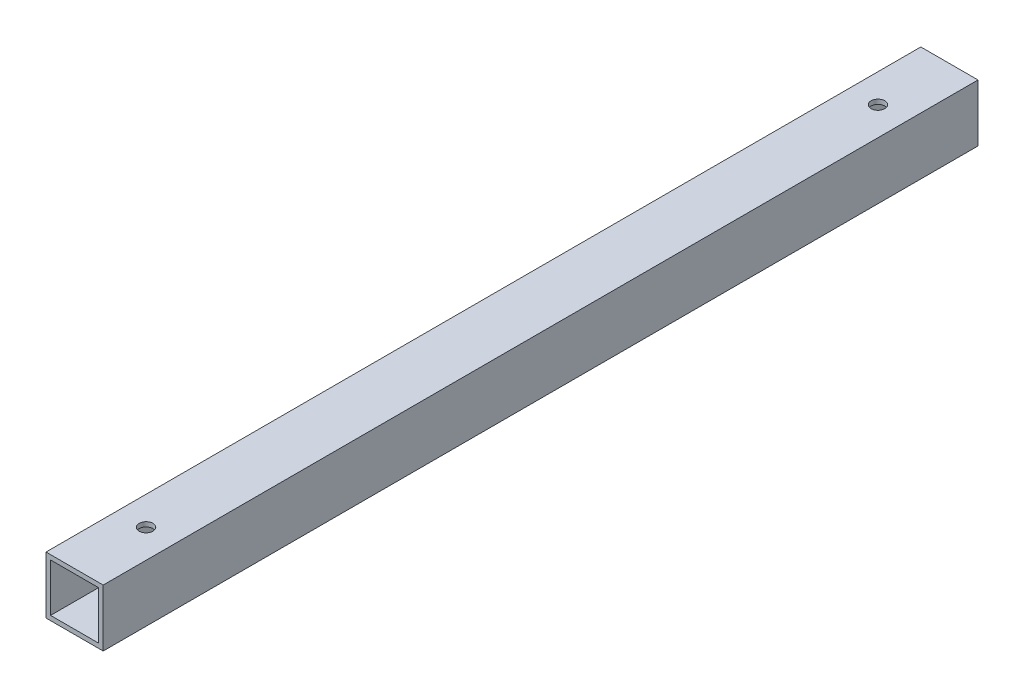
ISO-10303-21;
HEADER;
FILE_DESCRIPTION(('STEP AP214'),'2;1');
FILE_NAME('part.step','',(''),(''),'','','');
FILE_SCHEMA(('AUTOMOTIVE_DESIGN { 1 0 10303 214 1 1 1 1 }'));
ENDSEC;
DATA;
#1=APPLICATION_CONTEXT('core data for automotive mechanical design processes');
#2=APPLICATION_PROTOCOL_DEFINITION('international standard','automotive_design',2000,#1);
#3=PRODUCT_CONTEXT('',#1,'mechanical');
#4=PRODUCT('Part','Part','',(#3));
#5=PRODUCT_RELATED_PRODUCT_CATEGORY('part','',(#4));
#6=PRODUCT_DEFINITION_FORMATION('','',#4);
#7=PRODUCT_DEFINITION_CONTEXT('part definition',#1,'design');
#8=PRODUCT_DEFINITION('design','',#6,#7);
#9=PRODUCT_DEFINITION_SHAPE('','',#8);
#10=(LENGTH_UNIT() NAMED_UNIT(*) SI_UNIT(.MILLI.,.METRE.));
#11=(NAMED_UNIT(*) PLANE_ANGLE_UNIT() SI_UNIT($,.RADIAN.));
#12=(NAMED_UNIT(*) SI_UNIT($,.STERADIAN.) SOLID_ANGLE_UNIT());
#13=UNCERTAINTY_MEASURE_WITH_UNIT(LENGTH_MEASURE(1.E-05),#10,'distance_accuracy_value','');
#14=(GEOMETRIC_REPRESENTATION_CONTEXT(3) GLOBAL_UNCERTAINTY_ASSIGNED_CONTEXT((#13)) GLOBAL_UNIT_ASSIGNED_CONTEXT((#10,
#11,#12)) REPRESENTATION_CONTEXT('',''));
#15=CARTESIAN_POINT('',(0.,0.,0.));
#16=DIRECTION('',(0.,0.,1.));
#17=DIRECTION('',(1.,0.,0.));
#18=AXIS2_PLACEMENT_3D('',#15,#16,#17);
#19=CARTESIAN_POINT('',(0.,-25.,382.5));
#20=DIRECTION('',(0.,1.,0.));
#21=DIRECTION('',(0.,0.,1.));
#22=AXIS2_PLACEMENT_3D('',#19,#20,#21);
#23=PLANE('',#22);
#24=CARTESIAN_POINT('',(0.,-25.,320.));
#25=DIRECTION('',(0.,1.,0.));
#26=DIRECTION('',(0.,0.,1.));
#27=AXIS2_PLACEMENT_3D('',#24,#25,#26);
#28=CIRCLE('',#27,6.);
#29=CARTESIAN_POINT('',(0.,-25.,326.));
#30=VERTEX_POINT('',#29);
#31=EDGE_CURVE('E236',#30,#30,#28,.T.);
#32=ORIENTED_EDGE('',*,*,#31,.T.);
#33=EDGE_LOOP('',(#32));
#34=FACE_BOUND('',#33,.T.);
#35=CARTESIAN_POINT('',(-1.20015386316441E-13,-25.,-320.));
#36=DIRECTION('',(0.,1.,0.));
#37=DIRECTION('',(0.,0.,1.));
#38=AXIS2_PLACEMENT_3D('',#35,#36,#37);
#39=CIRCLE('',#38,6.);
#40=CARTESIAN_POINT('',(-1.20015386316441E-13,-25.,-314.));
#41=VERTEX_POINT('',#40);
#42=EDGE_CURVE('E163',#41,#41,#39,.T.);
#43=ORIENTED_EDGE('',*,*,#42,.T.);
#44=EDGE_LOOP('',(#43));
#45=FACE_BOUND('',#44,.T.);
#46=DIRECTION('',(1.,0.,0.));
#47=VECTOR('',#46,1.);
#48=CARTESIAN_POINT('',(0.,-25.,-382.5));
#49=LINE('',#48,#47);
#50=CARTESIAN_POINT('',(-25.,-25.,-382.5));
#51=VERTEX_POINT('',#50);
#52=CARTESIAN_POINT('',(25.,-25.,-382.5));
#53=VERTEX_POINT('',#52);
#54=EDGE_CURVE('E144',#51,#53,#49,.T.);
#55=ORIENTED_EDGE('',*,*,#54,.T.);
#56=DIRECTION('',(0.,0.,-1.));
#57=VECTOR('',#56,1.);
#58=CARTESIAN_POINT('',(25.,-25.,382.5));
#59=LINE('',#58,#57);
#60=CARTESIAN_POINT('',(25.,-25.,382.5));
#61=VERTEX_POINT('',#60);
#62=EDGE_CURVE('E11',#61,#53,#59,.T.);
#63=ORIENTED_EDGE('',*,*,#62,.F.);
#64=DIRECTION('',(1.,0.,0.));
#65=VECTOR('',#64,1.);
#66=CARTESIAN_POINT('',(0.,-25.,382.5));
#67=LINE('',#66,#65);
#68=CARTESIAN_POINT('',(-25.,-25.,382.5));
#69=VERTEX_POINT('',#68);
#70=EDGE_CURVE('E115',#69,#61,#67,.T.);
#71=ORIENTED_EDGE('',*,*,#70,.F.);
#72=DIRECTION('',(0.,0.,-1.));
#73=VECTOR('',#72,1.);
#74=CARTESIAN_POINT('',(-25.,-25.,382.5));
#75=LINE('',#74,#73);
#76=EDGE_CURVE('E54',#69,#51,#75,.T.);
#77=ORIENTED_EDGE('',*,*,#76,.T.);
#78=EDGE_LOOP('',(#55,#63,#71,#77));
#79=FACE_BOUND('',#78,.T.);
#80=ADVANCED_FACE('F35',(#34,#45,#79),#23,.F.);
#81=CARTESIAN_POINT('',(25.,0.,382.5));
#82=DIRECTION('',(-1.,0.,0.));
#83=DIRECTION('',(0.,0.,1.));
#84=AXIS2_PLACEMENT_3D('',#81,#82,#83);
#85=PLANE('',#84);
#86=DIRECTION('',(0.,1.,0.));
#87=VECTOR('',#86,1.);
#88=CARTESIAN_POINT('',(25.,0.,-382.5));
#89=LINE('',#88,#87);
#90=CARTESIAN_POINT('',(25.,25.,-382.5));
#91=VERTEX_POINT('',#90);
#92=EDGE_CURVE('E121',#53,#91,#89,.T.);
#93=ORIENTED_EDGE('',*,*,#92,.T.);
#94=DIRECTION('',(0.,0.,-1.));
#95=VECTOR('',#94,1.);
#96=CARTESIAN_POINT('',(25.,25.,382.5));
#97=LINE('',#96,#95);
#98=CARTESIAN_POINT('',(25.,25.,382.5));
#99=VERTEX_POINT('',#98);
#100=EDGE_CURVE('E45',#99,#91,#97,.T.);
#101=ORIENTED_EDGE('',*,*,#100,.F.);
#102=DIRECTION('',(0.,1.,0.));
#103=VECTOR('',#102,1.);
#104=CARTESIAN_POINT('',(25.,0.,382.5));
#105=LINE('',#104,#103);
#106=EDGE_CURVE('E109',#61,#99,#105,.T.);
#107=ORIENTED_EDGE('',*,*,#106,.F.);
#108=ORIENTED_EDGE('',*,*,#62,.T.);
#109=EDGE_LOOP('',(#93,#101,#107,#108));
#110=FACE_BOUND('',#109,.T.);
#111=ADVANCED_FACE('F120',(#110),#85,.F.);
#112=CARTESIAN_POINT('',(0.,25.,382.5));
#113=DIRECTION('',(0.,1.,0.));
#114=DIRECTION('',(0.,0.,1.));
#115=AXIS2_PLACEMENT_3D('',#112,#113,#114);
#116=PLANE('',#115);
#117=CARTESIAN_POINT('',(0.,25.,320.));
#118=DIRECTION('',(0.,1.,0.));
#119=DIRECTION('',(0.,0.,1.));
#120=AXIS2_PLACEMENT_3D('',#117,#118,#119);
#121=CIRCLE('',#120,6.);
#122=CARTESIAN_POINT('',(0.,25.,326.));
#123=VERTEX_POINT('',#122);
#124=EDGE_CURVE('E233',#123,#123,#121,.T.);
#125=ORIENTED_EDGE('',*,*,#124,.F.);
#126=EDGE_LOOP('',(#125));
#127=FACE_BOUND('',#126,.T.);
#128=CARTESIAN_POINT('',(-1.20015386316441E-13,25.,-320.));
#129=DIRECTION('',(0.,1.,0.));
#130=DIRECTION('',(0.,0.,1.));
#131=AXIS2_PLACEMENT_3D('',#128,#129,#130);
#132=CIRCLE('',#131,6.);
#133=CARTESIAN_POINT('',(-1.20015386316441E-13,25.,-314.));
#134=VERTEX_POINT('',#133);
#135=EDGE_CURVE('E169',#134,#134,#132,.T.);
#136=ORIENTED_EDGE('',*,*,#135,.F.);
#137=EDGE_LOOP('',(#136));
#138=FACE_BOUND('',#137,.T.);
#139=DIRECTION('',(1.,0.,0.));
#140=VECTOR('',#139,1.);
#141=CARTESIAN_POINT('',(0.,25.,-382.5));
#142=LINE('',#141,#140);
#143=CARTESIAN_POINT('',(-25.,25.,-382.5));
#144=VERTEX_POINT('',#143);
#145=EDGE_CURVE('E147',#144,#91,#142,.T.);
#146=ORIENTED_EDGE('',*,*,#145,.F.);
#147=DIRECTION('',(0.,0.,-1.));
#148=VECTOR('',#147,1.);
#149=CARTESIAN_POINT('',(-25.,25.,382.5));
#150=LINE('',#149,#148);
#151=CARTESIAN_POINT('',(-25.,25.,382.5));
#152=VERTEX_POINT('',#151);
#153=EDGE_CURVE('E80',#152,#144,#150,.T.);
#154=ORIENTED_EDGE('',*,*,#153,.F.);
#155=DIRECTION('',(1.,0.,0.));
#156=VECTOR('',#155,1.);
#157=CARTESIAN_POINT('',(0.,25.,382.5));
#158=LINE('',#157,#156);
#159=EDGE_CURVE('E114',#152,#99,#158,.T.);
#160=ORIENTED_EDGE('',*,*,#159,.T.);
#161=ORIENTED_EDGE('',*,*,#100,.T.);
#162=EDGE_LOOP('',(#146,#154,#160,#161));
#163=FACE_BOUND('',#162,.T.);
#164=ADVANCED_FACE('F125',(#127,#138,#163),#116,.T.);
#165=CARTESIAN_POINT('',(0.,-21.,382.5));
#166=DIRECTION('',(0.,1.,0.));
#167=DIRECTION('',(0.,0.,1.));
#168=AXIS2_PLACEMENT_3D('',#165,#166,#167);
#169=PLANE('',#168);
#170=CARTESIAN_POINT('',(0.,-21.,320.));
#171=DIRECTION('',(0.,1.,0.));
#172=DIRECTION('',(0.,0.,1.));
#173=AXIS2_PLACEMENT_3D('',#170,#171,#172);
#174=CIRCLE('',#173,6.);
#175=CARTESIAN_POINT('',(0.,-21.,326.));
#176=VERTEX_POINT('',#175);
#177=EDGE_CURVE('E174',#176,#176,#174,.T.);
#178=ORIENTED_EDGE('',*,*,#177,.F.);
#179=EDGE_LOOP('',(#178));
#180=FACE_BOUND('',#179,.T.);
#181=CARTESIAN_POINT('',(-1.20015386316441E-13,-21.,-320.));
#182=DIRECTION('',(0.,1.,0.));
#183=DIRECTION('',(0.,0.,1.));
#184=AXIS2_PLACEMENT_3D('',#181,#182,#183);
#185=CIRCLE('',#184,6.);
#186=CARTESIAN_POINT('',(-1.20015386316441E-13,-21.,-314.));
#187=VERTEX_POINT('',#186);
#188=EDGE_CURVE('E136',#187,#187,#185,.T.);
#189=ORIENTED_EDGE('',*,*,#188,.F.);
#190=EDGE_LOOP('',(#189));
#191=FACE_BOUND('',#190,.T.);
#192=DIRECTION('',(1.,0.,0.));
#193=VECTOR('',#192,1.);
#194=CARTESIAN_POINT('',(0.,-21.,-382.5));
#195=LINE('',#194,#193);
#196=CARTESIAN_POINT('',(-21.,-21.,-382.5));
#197=VERTEX_POINT('',#196);
#198=CARTESIAN_POINT('',(21.,-21.,-382.5));
#199=VERTEX_POINT('',#198);
#200=EDGE_CURVE('E132',#197,#199,#195,.T.);
#201=ORIENTED_EDGE('',*,*,#200,.F.);
#202=DIRECTION('',(0.,0.,-1.));
#203=VECTOR('',#202,1.);
#204=CARTESIAN_POINT('',(-21.,-21.,382.5));
#205=LINE('',#204,#203);
#206=CARTESIAN_POINT('',(-21.,-21.,382.5));
#207=VERTEX_POINT('',#206);
#208=EDGE_CURVE('E92',#207,#197,#205,.T.);
#209=ORIENTED_EDGE('',*,*,#208,.F.);
#210=DIRECTION('',(1.,0.,0.));
#211=VECTOR('',#210,1.);
#212=CARTESIAN_POINT('',(0.,-21.,382.5));
#213=LINE('',#212,#211);
#214=CARTESIAN_POINT('',(21.,-21.,382.5));
#215=VERTEX_POINT('',#214);
#216=EDGE_CURVE('E152',#207,#215,#213,.T.);
#217=ORIENTED_EDGE('',*,*,#216,.T.);
#218=DIRECTION('',(0.,0.,-1.));
#219=VECTOR('',#218,1.);
#220=CARTESIAN_POINT('',(21.,-21.,382.5));
#221=LINE('',#220,#219);
#222=EDGE_CURVE('E128',#215,#199,#221,.T.);
#223=ORIENTED_EDGE('',*,*,#222,.T.);
#224=EDGE_LOOP('',(#201,#209,#217,#223));
#225=FACE_BOUND('',#224,.T.);
#226=ADVANCED_FACE('F37',(#180,#191,#225),#169,.T.);
#227=CARTESIAN_POINT('',(-21.,0.,382.5));
#228=DIRECTION('',(-1.,0.,0.));
#229=DIRECTION('',(0.,0.,1.));
#230=AXIS2_PLACEMENT_3D('',#227,#228,#229);
#231=PLANE('',#230);
#232=DIRECTION('',(0.,1.,0.));
#233=VECTOR('',#232,1.);
#234=CARTESIAN_POINT('',(-21.,0.,-382.5));
#235=LINE('',#234,#233);
#236=CARTESIAN_POINT('',(-21.,21.,-382.5));
#237=VERTEX_POINT('',#236);
#238=EDGE_CURVE('E135',#197,#237,#235,.T.);
#239=ORIENTED_EDGE('',*,*,#238,.T.);
#240=DIRECTION('',(0.,0.,-1.));
#241=VECTOR('',#240,1.);
#242=CARTESIAN_POINT('',(-21.,21.,382.5));
#243=LINE('',#242,#241);
#244=CARTESIAN_POINT('',(-21.,21.,382.5));
#245=VERTEX_POINT('',#244);
#246=EDGE_CURVE('E158',#245,#237,#243,.T.);
#247=ORIENTED_EDGE('',*,*,#246,.F.);
#248=DIRECTION('',(0.,1.,0.));
#249=VECTOR('',#248,1.);
#250=CARTESIAN_POINT('',(-21.,0.,382.5));
#251=LINE('',#250,#249);
#252=EDGE_CURVE('E180',#207,#245,#251,.T.);
#253=ORIENTED_EDGE('',*,*,#252,.F.);
#254=ORIENTED_EDGE('',*,*,#208,.T.);
#255=EDGE_LOOP('',(#239,#247,#253,#254));
#256=FACE_BOUND('',#255,.T.);
#257=ADVANCED_FACE('F203',(#256),#231,.F.);
#258=CARTESIAN_POINT('',(0.,21.,382.5));
#259=DIRECTION('',(0.,1.,0.));
#260=DIRECTION('',(-1.,0.,0.));
#261=AXIS2_PLACEMENT_3D('',#258,#259,#260);
#262=PLANE('',#261);
#263=CARTESIAN_POINT('',(0.,21.,320.));
#264=DIRECTION('',(0.,1.,0.));
#265=DIRECTION('',(-1.,0.,0.));
#266=AXIS2_PLACEMENT_3D('',#263,#264,#265);
#267=CIRCLE('',#266,6.);
#268=CARTESIAN_POINT('',(-5.99999999999993,21.,320.));
#269=VERTEX_POINT('',#268);
#270=EDGE_CURVE('E39',#269,#269,#267,.T.);
#271=ORIENTED_EDGE('',*,*,#270,.T.);
#272=EDGE_LOOP('',(#271));
#273=FACE_BOUND('',#272,.T.);
#274=CARTESIAN_POINT('',(-1.20015386316441E-13,21.,-320.));
#275=DIRECTION('',(0.,1.,0.));
#276=DIRECTION('',(-1.,0.,0.));
#277=AXIS2_PLACEMENT_3D('',#274,#275,#276);
#278=CIRCLE('',#277,6.);
#279=CARTESIAN_POINT('',(-6.00000000000012,21.,-320.));
#280=VERTEX_POINT('',#279);
#281=EDGE_CURVE('E161',#280,#280,#278,.T.);
#282=ORIENTED_EDGE('',*,*,#281,.T.);
#283=EDGE_LOOP('',(#282));
#284=FACE_BOUND('',#283,.T.);
#285=DIRECTION('',(1.,0.,0.));
#286=VECTOR('',#285,1.);
#287=CARTESIAN_POINT('',(0.,21.,-382.5));
#288=LINE('',#287,#286);
#289=CARTESIAN_POINT('',(21.,21.,-382.5));
#290=VERTEX_POINT('',#289);
#291=EDGE_CURVE('E138',#237,#290,#288,.T.);
#292=ORIENTED_EDGE('',*,*,#291,.T.);
#293=DIRECTION('',(0.,0.,-1.));
#294=VECTOR('',#293,1.);
#295=CARTESIAN_POINT('',(21.,21.,382.5));
#296=LINE('',#295,#294);
#297=CARTESIAN_POINT('',(21.,21.,382.5));
#298=VERTEX_POINT('',#297);
#299=EDGE_CURVE('E156',#298,#290,#296,.T.);
#300=ORIENTED_EDGE('',*,*,#299,.F.);
#301=DIRECTION('',(1.,0.,0.));
#302=VECTOR('',#301,1.);
#303=CARTESIAN_POINT('',(0.,21.,382.5));
#304=LINE('',#303,#302);
#305=EDGE_CURVE('E182',#245,#298,#304,.T.);
#306=ORIENTED_EDGE('',*,*,#305,.F.);
#307=ORIENTED_EDGE('',*,*,#246,.T.);
#308=EDGE_LOOP('',(#292,#300,#306,#307));
#309=FACE_BOUND('',#308,.T.);
#310=ADVANCED_FACE('F196',(#273,#284,#309),#262,.F.);
#311=CARTESIAN_POINT('',(21.,0.,382.5));
#312=DIRECTION('',(-1.,0.,0.));
#313=DIRECTION('',(0.,-1.,0.));
#314=AXIS2_PLACEMENT_3D('',#311,#312,#313);
#315=PLANE('',#314);
#316=DIRECTION('',(0.,1.,0.));
#317=VECTOR('',#316,1.);
#318=CARTESIAN_POINT('',(21.,0.,-382.5));
#319=LINE('',#318,#317);
#320=EDGE_CURVE('E141',#199,#290,#319,.T.);
#321=ORIENTED_EDGE('',*,*,#320,.F.);
#322=ORIENTED_EDGE('',*,*,#222,.F.);
#323=DIRECTION('',(0.,1.,0.));
#324=VECTOR('',#323,1.);
#325=CARTESIAN_POINT('',(21.,0.,382.5));
#326=LINE('',#325,#324);
#327=EDGE_CURVE('E184',#215,#298,#326,.T.);
#328=ORIENTED_EDGE('',*,*,#327,.T.);
#329=ORIENTED_EDGE('',*,*,#299,.T.);
#330=EDGE_LOOP('',(#321,#322,#328,#329));
#331=FACE_BOUND('',#330,.T.);
#332=ADVANCED_FACE('F189',(#331),#315,.T.);
#333=CARTESIAN_POINT('',(-25.,0.,382.5));
#334=DIRECTION('',(-1.,0.,0.));
#335=DIRECTION('',(0.,0.,1.));
#336=AXIS2_PLACEMENT_3D('',#333,#334,#335);
#337=PLANE('',#336);
#338=DIRECTION('',(0.,1.,0.));
#339=VECTOR('',#338,1.);
#340=CARTESIAN_POINT('',(-25.,0.,-382.5));
#341=LINE('',#340,#339);
#342=EDGE_CURVE('E149',#51,#144,#341,.T.);
#343=ORIENTED_EDGE('',*,*,#342,.F.);
#344=ORIENTED_EDGE('',*,*,#76,.F.);
#345=DIRECTION('',(0.,1.,0.));
#346=VECTOR('',#345,1.);
#347=CARTESIAN_POINT('',(-25.,0.,382.5));
#348=LINE('',#347,#346);
#349=EDGE_CURVE('E126',#69,#152,#348,.T.);
#350=ORIENTED_EDGE('',*,*,#349,.T.);
#351=ORIENTED_EDGE('',*,*,#153,.T.);
#352=EDGE_LOOP('',(#343,#344,#350,#351));
#353=FACE_BOUND('',#352,.T.);
#354=ADVANCED_FACE('F225',(#353),#337,.T.);
#355=CARTESIAN_POINT('',(0.,0.,382.5));
#356=DIRECTION('',(0.,0.,1.));
#357=DIRECTION('',(1.,0.,0.));
#358=AXIS2_PLACEMENT_3D('',#355,#356,#357);
#359=PLANE('',#358);
#360=ORIENTED_EDGE('',*,*,#216,.F.);
#361=ORIENTED_EDGE('',*,*,#252,.T.);
#362=ORIENTED_EDGE('',*,*,#305,.T.);
#363=ORIENTED_EDGE('',*,*,#327,.F.);
#364=EDGE_LOOP('',(#360,#361,#362,#363));
#365=FACE_BOUND('',#364,.T.);
#366=ORIENTED_EDGE('',*,*,#70,.T.);
#367=ORIENTED_EDGE('',*,*,#106,.T.);
#368=ORIENTED_EDGE('',*,*,#159,.F.);
#369=ORIENTED_EDGE('',*,*,#349,.F.);
#370=EDGE_LOOP('',(#366,#367,#368,#369));
#371=FACE_BOUND('',#370,.T.);
#372=ADVANCED_FACE('F111',(#365,#371),#359,.T.);
#373=CARTESIAN_POINT('',(0.,0.,-382.5));
#374=DIRECTION('',(0.,0.,1.));
#375=DIRECTION('',(1.,0.,0.));
#376=AXIS2_PLACEMENT_3D('',#373,#374,#375);
#377=PLANE('',#376);
#378=ORIENTED_EDGE('',*,*,#200,.T.);
#379=ORIENTED_EDGE('',*,*,#320,.T.);
#380=ORIENTED_EDGE('',*,*,#291,.F.);
#381=ORIENTED_EDGE('',*,*,#238,.F.);
#382=EDGE_LOOP('',(#378,#379,#380,#381));
#383=FACE_BOUND('',#382,.T.);
#384=ORIENTED_EDGE('',*,*,#54,.F.);
#385=ORIENTED_EDGE('',*,*,#342,.T.);
#386=ORIENTED_EDGE('',*,*,#145,.T.);
#387=ORIENTED_EDGE('',*,*,#92,.F.);
#388=EDGE_LOOP('',(#384,#385,#386,#387));
#389=FACE_BOUND('',#388,.T.);
#390=ADVANCED_FACE('F200',(#383,#389),#377,.F.);
#391=CARTESIAN_POINT('',(-1.20015386316441E-13,-25.,-320.));
#392=DIRECTION('',(0.,1.,0.));
#393=DIRECTION('',(0.,0.,1.));
#394=AXIS2_PLACEMENT_3D('',#391,#392,#393);
#395=CYLINDRICAL_SURFACE('',#394,6.);
#396=ORIENTED_EDGE('',*,*,#135,.T.);
#397=EDGE_LOOP('',(#396));
#398=FACE_BOUND('',#397,.T.);
#399=ORIENTED_EDGE('',*,*,#281,.F.);
#400=EDGE_LOOP('',(#399));
#401=FACE_BOUND('',#400,.T.);
#402=ADVANCED_FACE('F254',(#398,#401),#395,.F.);
#403=ORIENTED_EDGE('',*,*,#188,.T.);
#404=EDGE_LOOP('',(#403));
#405=FACE_BOUND('',#404,.T.);
#406=ORIENTED_EDGE('',*,*,#42,.F.);
#407=EDGE_LOOP('',(#406));
#408=FACE_BOUND('',#407,.T.);
#409=ADVANCED_FACE('F250',(#405,#408),#395,.F.);
#410=CARTESIAN_POINT('',(0.,-25.,320.));
#411=DIRECTION('',(0.,1.,0.));
#412=DIRECTION('',(0.,0.,1.));
#413=AXIS2_PLACEMENT_3D('',#410,#411,#412);
#414=CYLINDRICAL_SURFACE('',#413,6.);
#415=ORIENTED_EDGE('',*,*,#124,.T.);
#416=EDGE_LOOP('',(#415));
#417=FACE_BOUND('',#416,.T.);
#418=ORIENTED_EDGE('',*,*,#270,.F.);
#419=EDGE_LOOP('',(#418));
#420=FACE_BOUND('',#419,.T.);
#421=ADVANCED_FACE('F244',(#417,#420),#414,.F.);
#422=ORIENTED_EDGE('',*,*,#177,.T.);
#423=EDGE_LOOP('',(#422));
#424=FACE_BOUND('',#423,.T.);
#425=ORIENTED_EDGE('',*,*,#31,.F.);
#426=EDGE_LOOP('',(#425));
#427=FACE_BOUND('',#426,.T.);
#428=ADVANCED_FACE('F242',(#424,#427),#414,.F.);
#429=CLOSED_SHELL('',(#80,#111,#164,#226,#257,#310,#332,#354,#372,#390,#402,#409,#421,#428));
#430=MANIFOLD_SOLID_BREP('B2',#429);
#431=ADVANCED_BREP_SHAPE_REPRESENTATION('',(#18,#430),#14);
#432=SHAPE_DEFINITION_REPRESENTATION(#9,#431);
ENDSEC;
END-ISO-10303-21;
